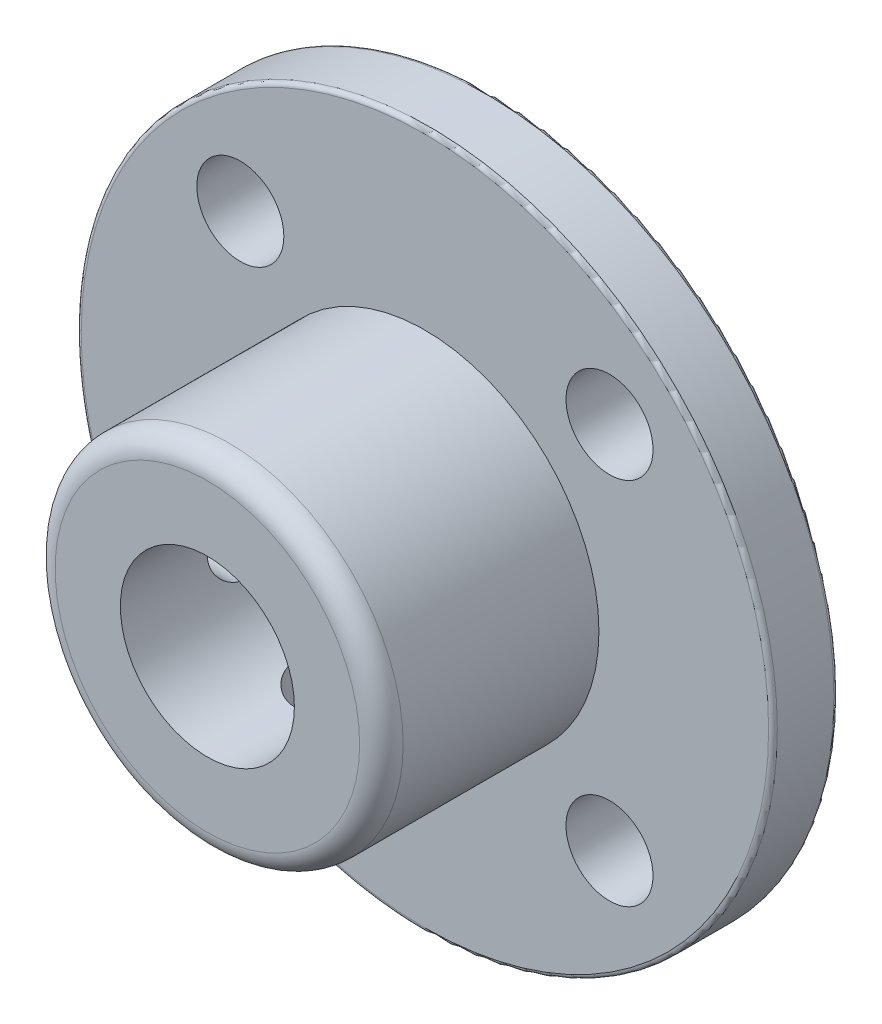
ISO-10303-21;
HEADER;
FILE_DESCRIPTION(('STEP AP214'),'2;1');
FILE_NAME('part.step','',(''),(''),'','','');
FILE_SCHEMA(('AUTOMOTIVE_DESIGN { 1 0 10303 214 1 1 1 1 }'));
ENDSEC;
DATA;
#1=APPLICATION_CONTEXT('core data for automotive mechanical design processes');
#2=APPLICATION_PROTOCOL_DEFINITION('international standard','automotive_design',2000,#1);
#3=PRODUCT_CONTEXT('',#1,'mechanical');
#4=PRODUCT('Part','Part','',(#3));
#5=PRODUCT_RELATED_PRODUCT_CATEGORY('part','',(#4));
#6=PRODUCT_DEFINITION_FORMATION('','',#4);
#7=PRODUCT_DEFINITION_CONTEXT('part definition',#1,'design');
#8=PRODUCT_DEFINITION('design','',#6,#7);
#9=PRODUCT_DEFINITION_SHAPE('','',#8);
#10=(LENGTH_UNIT() NAMED_UNIT(*) SI_UNIT(.MILLI.,.METRE.));
#11=(NAMED_UNIT(*) PLANE_ANGLE_UNIT() SI_UNIT($,.RADIAN.));
#12=(NAMED_UNIT(*) SI_UNIT($,.STERADIAN.) SOLID_ANGLE_UNIT());
#13=UNCERTAINTY_MEASURE_WITH_UNIT(LENGTH_MEASURE(1.E-05),#10,'distance_accuracy_value','');
#14=(GEOMETRIC_REPRESENTATION_CONTEXT(3) GLOBAL_UNCERTAINTY_ASSIGNED_CONTEXT((#13)) GLOBAL_UNIT_ASSIGNED_CONTEXT((#10,
#11,#12)) REPRESENTATION_CONTEXT('',''));
#15=CARTESIAN_POINT('',(0.,0.,0.));
#16=DIRECTION('',(0.,0.,1.));
#17=DIRECTION('',(1.,0.,0.));
#18=AXIS2_PLACEMENT_3D('',#15,#16,#17);
#19=CARTESIAN_POINT('',(0.,0.,3.));
#20=DIRECTION('',(0.,0.,-1.));
#21=DIRECTION('',(-1.,0.,0.));
#22=AXIS2_PLACEMENT_3D('',#19,#20,#21);
#23=CYLINDRICAL_SURFACE('',#22,16.);
#24=CARTESIAN_POINT('',(0.,0.,0.2));
#25=DIRECTION('',(0.,0.,1.));
#26=DIRECTION('',(1.,0.,0.));
#27=AXIS2_PLACEMENT_3D('',#24,#25,#26);
#28=CIRCLE('',#27,16.);
#29=CARTESIAN_POINT('',(16.,0.,0.2));
#30=VERTEX_POINT('',#29);
#31=EDGE_CURVE('E47',#30,#30,#28,.T.);
#32=ORIENTED_EDGE('',*,*,#31,.T.);
#33=EDGE_LOOP('',(#32));
#34=FACE_BOUND('',#33,.T.);
#35=CARTESIAN_POINT('',(0.,0.,2.8));
#36=DIRECTION('',(0.,0.,1.));
#37=DIRECTION('',(1.,0.,0.));
#38=AXIS2_PLACEMENT_3D('',#35,#36,#37);
#39=CIRCLE('',#38,16.);
#40=CARTESIAN_POINT('',(16.,0.,2.8));
#41=VERTEX_POINT('',#40);
#42=EDGE_CURVE('E51',#41,#41,#39,.F.);
#43=ORIENTED_EDGE('',*,*,#42,.T.);
#44=EDGE_LOOP('',(#43));
#45=FACE_BOUND('',#44,.T.);
#46=ADVANCED_FACE('F36',(#34,#45),#23,.T.);
#47=CARTESIAN_POINT('',(0.,0.,3.));
#48=DIRECTION('',(0.,0.,1.));
#49=DIRECTION('',(1.,0.,0.));
#50=AXIS2_PLACEMENT_3D('',#47,#48,#49);
#51=PLANE('',#50);
#52=CARTESIAN_POINT('',(0.,0.,3.));
#53=DIRECTION('',(0.,0.,1.));
#54=DIRECTION('',(1.,0.,0.));
#55=AXIS2_PLACEMENT_3D('',#52,#53,#54);
#56=CIRCLE('',#55,15.8);
#57=CARTESIAN_POINT('',(15.8,0.,3.));
#58=VERTEX_POINT('',#57);
#59=EDGE_CURVE('E10',#58,#58,#56,.T.);
#60=ORIENTED_EDGE('',*,*,#59,.T.);
#61=EDGE_LOOP('',(#60));
#62=FACE_BOUND('',#61,.T.);
#63=CARTESIAN_POINT('',(-8.48528137423857,-8.48528137423857,3.));
#64=DIRECTION('',(0.,0.,1.));
#65=DIRECTION('',(1.,0.,0.));
#66=AXIS2_PLACEMENT_3D('',#63,#64,#65);
#67=CIRCLE('',#66,2.);
#68=CARTESIAN_POINT('',(-6.48528137423857,-8.48528137423857,3.));
#69=VERTEX_POINT('',#68);
#70=EDGE_CURVE('E275',#69,#69,#67,.T.);
#71=ORIENTED_EDGE('',*,*,#70,.F.);
#72=EDGE_LOOP('',(#71));
#73=FACE_BOUND('',#72,.T.);
#74=CARTESIAN_POINT('',(8.48528137423857,-8.48528137423857,3.));
#75=DIRECTION('',(0.,0.,1.));
#76=DIRECTION('',(1.,0.,0.));
#77=AXIS2_PLACEMENT_3D('',#74,#75,#76);
#78=CIRCLE('',#77,2.);
#79=CARTESIAN_POINT('',(10.4852813742386,-8.48528137423857,3.));
#80=VERTEX_POINT('',#79);
#81=EDGE_CURVE('E281',#80,#80,#78,.T.);
#82=ORIENTED_EDGE('',*,*,#81,.F.);
#83=EDGE_LOOP('',(#82));
#84=FACE_BOUND('',#83,.T.);
#85=CARTESIAN_POINT('',(8.48528137423857,8.48528137423857,3.));
#86=DIRECTION('',(0.,0.,1.));
#87=DIRECTION('',(1.,0.,0.));
#88=AXIS2_PLACEMENT_3D('',#85,#86,#87);
#89=CIRCLE('',#88,2.);
#90=CARTESIAN_POINT('',(10.4852813742386,8.48528137423857,3.));
#91=VERTEX_POINT('',#90);
#92=EDGE_CURVE('E248',#91,#91,#89,.T.);
#93=ORIENTED_EDGE('',*,*,#92,.F.);
#94=EDGE_LOOP('',(#93));
#95=FACE_BOUND('',#94,.T.);
#96=CARTESIAN_POINT('',(-8.48528137423857,8.48528137423857,3.));
#97=DIRECTION('',(0.,0.,1.));
#98=DIRECTION('',(1.,0.,0.));
#99=AXIS2_PLACEMENT_3D('',#96,#97,#98);
#100=CIRCLE('',#99,2.);
#101=CARTESIAN_POINT('',(-6.48528137423857,8.48528137423857,3.));
#102=VERTEX_POINT('',#101);
#103=EDGE_CURVE('E241',#102,#102,#100,.T.);
#104=ORIENTED_EDGE('',*,*,#103,.F.);
#105=EDGE_LOOP('',(#104));
#106=FACE_BOUND('',#105,.T.);
#107=CARTESIAN_POINT('',(0.,0.,3.));
#108=DIRECTION('',(0.,0.,1.));
#109=DIRECTION('',(1.,0.,0.));
#110=AXIS2_PLACEMENT_3D('',#107,#108,#109);
#111=CIRCLE('',#110,8.);
#112=CARTESIAN_POINT('',(8.,0.,3.));
#113=VERTEX_POINT('',#112);
#114=EDGE_CURVE('E254',#113,#113,#111,.T.);
#115=ORIENTED_EDGE('',*,*,#114,.F.);
#116=EDGE_LOOP('',(#115));
#117=FACE_BOUND('',#116,.T.);
#118=ADVANCED_FACE('F104',(#62,#73,#84,#95,#106,#117),#51,.T.);
#119=CARTESIAN_POINT('',(0.,0.,0.));
#120=DIRECTION('',(0.,0.,1.));
#121=DIRECTION('',(1.,0.,0.));
#122=AXIS2_PLACEMENT_3D('',#119,#120,#121);
#123=PLANE('',#122);
#124=CARTESIAN_POINT('',(0.,0.,0.));
#125=DIRECTION('',(0.,0.,1.));
#126=DIRECTION('',(1.,0.,0.));
#127=AXIS2_PLACEMENT_3D('',#124,#125,#126);
#128=CIRCLE('',#127,15.8);
#129=CARTESIAN_POINT('',(15.8,0.,0.));
#130=VERTEX_POINT('',#129);
#131=EDGE_CURVE('E43',#130,#130,#128,.F.);
#132=ORIENTED_EDGE('',*,*,#131,.T.);
#133=EDGE_LOOP('',(#132));
#134=FACE_BOUND('',#133,.T.);
#135=CARTESIAN_POINT('',(-8.48528137423857,-8.48528137423857,0.));
#136=DIRECTION('',(0.,0.,1.));
#137=DIRECTION('',(1.,0.,0.));
#138=AXIS2_PLACEMENT_3D('',#135,#136,#137);
#139=CIRCLE('',#138,2.);
#140=CARTESIAN_POINT('',(-6.48528137423857,-8.48528137423857,0.));
#141=VERTEX_POINT('',#140);
#142=EDGE_CURVE('E278',#141,#141,#139,.T.);
#143=ORIENTED_EDGE('',*,*,#142,.T.);
#144=EDGE_LOOP('',(#143));
#145=FACE_BOUND('',#144,.T.);
#146=CARTESIAN_POINT('',(8.48528137423857,-8.48528137423857,0.));
#147=DIRECTION('',(0.,0.,1.));
#148=DIRECTION('',(1.,0.,0.));
#149=AXIS2_PLACEMENT_3D('',#146,#147,#148);
#150=CIRCLE('',#149,2.);
#151=CARTESIAN_POINT('',(10.4852813742386,-8.48528137423857,0.));
#152=VERTEX_POINT('',#151);
#153=EDGE_CURVE('E284',#152,#152,#150,.T.);
#154=ORIENTED_EDGE('',*,*,#153,.T.);
#155=EDGE_LOOP('',(#154));
#156=FACE_BOUND('',#155,.T.);
#157=CARTESIAN_POINT('',(8.48528137423857,8.48528137423857,0.));
#158=DIRECTION('',(0.,0.,1.));
#159=DIRECTION('',(1.,0.,0.));
#160=AXIS2_PLACEMENT_3D('',#157,#158,#159);
#161=CIRCLE('',#160,2.);
#162=CARTESIAN_POINT('',(10.4852813742386,8.48528137423857,0.));
#163=VERTEX_POINT('',#162);
#164=EDGE_CURVE('E243',#163,#163,#161,.T.);
#165=ORIENTED_EDGE('',*,*,#164,.T.);
#166=EDGE_LOOP('',(#165));
#167=FACE_BOUND('',#166,.T.);
#168=CARTESIAN_POINT('',(-8.48528137423857,8.48528137423857,0.));
#169=DIRECTION('',(0.,0.,1.));
#170=DIRECTION('',(1.,0.,0.));
#171=AXIS2_PLACEMENT_3D('',#168,#169,#170);
#172=CIRCLE('',#171,2.);
#173=CARTESIAN_POINT('',(-6.48528137423857,8.48528137423857,0.));
#174=VERTEX_POINT('',#173);
#175=EDGE_CURVE('E238',#174,#174,#172,.T.);
#176=ORIENTED_EDGE('',*,*,#175,.T.);
#177=EDGE_LOOP('',(#176));
#178=FACE_BOUND('',#177,.T.);
#179=CARTESIAN_POINT('',(0.,0.,0.));
#180=DIRECTION('',(0.,0.,1.));
#181=DIRECTION('',(1.,0.,0.));
#182=AXIS2_PLACEMENT_3D('',#179,#180,#181);
#183=CIRCLE('',#182,4.);
#184=CARTESIAN_POINT('',(4.,0.,0.));
#185=VERTEX_POINT('',#184);
#186=EDGE_CURVE('E251',#185,#185,#183,.T.);
#187=ORIENTED_EDGE('',*,*,#186,.T.);
#188=EDGE_LOOP('',(#187));
#189=FACE_BOUND('',#188,.T.);
#190=ADVANCED_FACE('F102',(#134,#145,#156,#167,#178,#189),#123,.F.);
#191=CARTESIAN_POINT('',(0.,0.,13.));
#192=DIRECTION('',(0.,0.,-1.));
#193=DIRECTION('',(-1.,0.,0.));
#194=AXIS2_PLACEMENT_3D('',#191,#192,#193);
#195=CYLINDRICAL_SURFACE('',#194,8.);
#196=CARTESIAN_POINT('',(0.,-8.,9.));
#197=CARTESIAN_POINT('',(0.0834717464654709,-7.99999848833852,8.99999681041172));
#198=CARTESIAN_POINT('',(0.166984992730099,-7.99868009921714,8.99300892338062));
#199=CARTESIAN_POINT('',(0.331658129841797,-7.9935478589052,8.96526000488165));
#200=CARTESIAN_POINT('',(0.412815974152225,-7.98973190166897,8.94448734936027));
#201=CARTESIAN_POINT('',(0.570372961851801,-7.98003138765458,8.88982729874066));
#202=CARTESIAN_POINT('',(0.646776330685344,-7.97414869946483,8.85595174754746));
#203=CARTESIAN_POINT('',(0.792807973094007,-7.96095710599783,8.77608112307718));
#204=CARTESIAN_POINT('',(0.862436794477323,-7.9536483161829,8.73008703085518));
#205=CARTESIAN_POINT('',(0.993783715930502,-7.93831336430504,8.62670023199632));
#206=CARTESIAN_POINT('',(1.05540895503183,-7.93028034856351,8.56919055532986));
#207=CARTESIAN_POINT('',(1.16819606135369,-7.9144531845865,8.44465669091244));
#208=CARTESIAN_POINT('',(1.21935717689241,-7.90665905354527,8.37763182023071));
#209=CARTESIAN_POINT('',(1.31014998665793,-7.89212551245005,8.23531391163603));
#210=CARTESIAN_POINT('',(1.34968721969605,-7.88539493886182,8.15995962968276));
#211=CARTESIAN_POINT('',(1.41550524332283,-7.87384713211987,8.00353108482321));
#212=CARTESIAN_POINT('',(1.44178717713098,-7.86902973396962,7.92245731588878));
#213=CARTESIAN_POINT('',(1.480050535035,-7.8619226957455,7.75788476908559));
#214=CARTESIAN_POINT('',(1.49219390192039,-7.85960445366405,7.67442490279654));
#215=CARTESIAN_POINT('',(1.50233808095346,-7.85767197152761,7.50662261519175));
#216=CARTESIAN_POINT('',(1.50034016135374,-7.8580574889876,7.4222802736977));
#217=CARTESIAN_POINT('',(1.48238979602362,-7.86146292701753,7.25628047473395));
#218=CARTESIAN_POINT('',(1.46662149996045,-7.86444808147334,7.17460228569985));
#219=CARTESIAN_POINT('',(1.42186799396207,-7.87266183284666,7.01507158021739));
#220=CARTESIAN_POINT('',(1.39288222239499,-7.87789052509516,6.9372192264907));
#221=CARTESIAN_POINT('',(1.322336471793,-7.89003855292588,6.78701132099974));
#222=CARTESIAN_POINT('',(1.28070213532456,-7.89696783823366,6.71469152941919));
#223=CARTESIAN_POINT('',(1.18609368930416,-7.91172971602918,6.57799527145977));
#224=CARTESIAN_POINT('',(1.13311842889266,-7.91956240015522,6.5136196122852));
#225=CARTESIAN_POINT('',(1.01633905685298,-7.93540001272164,6.39357504432754));
#226=CARTESIAN_POINT('',(0.952377436860683,-7.9434057102403,6.33805934754826));
#227=CARTESIAN_POINT('',(0.815968037098827,-7.95857386108318,6.23852275932459));
#228=CARTESIAN_POINT('',(0.74352017225577,-7.96573630595245,6.19450198312958));
#229=CARTESIAN_POINT('',(0.592034988874669,-7.97842539677509,6.11918224612998));
#230=CARTESIAN_POINT('',(0.512989564446494,-7.98394999136289,6.0878992208821));
#231=CARTESIAN_POINT('',(0.350639115398697,-7.99272505402719,6.03909790690784));
#232=CARTESIAN_POINT('',(0.267334544277787,-7.99597576367994,6.02157815595464));
#233=CARTESIAN_POINT('',(0.100148652903386,-7.99980360641981,6.00101396898173));
#234=CARTESIAN_POINT('',(0.0162940126341359,-8.00041950912279,5.99775960847027));
#235=CARTESIAN_POINT('',(-0.150761248092183,-7.99901543598228,6.00525547954765));
#236=CARTESIAN_POINT('',(-0.233961900480385,-7.99699558964431,6.01600502306526));
#237=CARTESIAN_POINT('',(-0.396681573218217,-7.99057111500406,6.05102903518337));
#238=CARTESIAN_POINT('',(-0.476224261046063,-7.98618522374031,6.07519728253781));
#239=CARTESIAN_POINT('',(-0.630128631824633,-7.97551842212498,6.13625770677879));
#240=CARTESIAN_POINT('',(-0.704489962595103,-7.96923738311334,6.17315074756578));
#241=CARTESIAN_POINT('',(-0.846816671513214,-7.95538030357666,6.25907812815951));
#242=CARTESIAN_POINT('',(-0.914703277015121,-7.94779086174563,6.30824073853684));
#243=CARTESIAN_POINT('',(-1.04133832326455,-7.93219343489712,6.41713813736236));
#244=CARTESIAN_POINT('',(-1.10008590976087,-7.92418541084687,6.47687391300133));
#245=CARTESIAN_POINT('',(-1.20757295872048,-7.9085247569745,6.60617231891143));
#246=CARTESIAN_POINT('',(-1.25616916218577,-7.90087825860257,6.67585490812539));
#247=CARTESIAN_POINT('',(-1.34096675057787,-7.88692985578532,6.82251762452375));
#248=CARTESIAN_POINT('',(-1.37716859613924,-7.8806279013735,6.89949748037047));
#249=CARTESIAN_POINT('',(-1.43594673512823,-7.87013024209574,7.05820586724254));
#250=CARTESIAN_POINT('',(-1.45858868794786,-7.86592440436878,7.13990937955933));
#251=CARTESIAN_POINT('',(-1.48980679326235,-7.86007203802415,7.3060472225214));
#252=CARTESIAN_POINT('',(-1.49838453270708,-7.8584252206579,7.3904812439704));
#253=CARTESIAN_POINT('',(-1.50117762148355,-7.85789199803857,7.55824833144151));
#254=CARTESIAN_POINT('',(-1.49561895003499,-7.85896215974293,7.64157758095699));
#255=CARTESIAN_POINT('',(-1.47079175378803,-7.86364600659998,7.80609142204529));
#256=CARTESIAN_POINT('',(-1.45152331089332,-7.86725967655747,7.88727602642744));
#257=CARTESIAN_POINT('',(-1.39991887583263,-7.8766050802318,8.04507448479548));
#258=CARTESIAN_POINT('',(-1.36760735397252,-7.88233284594965,8.12169659134577));
#259=CARTESIAN_POINT('',(-1.29085868912204,-7.8952638755184,8.26846825424084));
#260=CARTESIAN_POINT('',(-1.24642068948186,-7.90246724360119,8.33861735284478));
#261=CARTESIAN_POINT('',(-1.14589487339535,-7.91767266107745,8.4715836800423));
#262=CARTESIAN_POINT('',(-1.08964259864303,-7.92568505353043,8.5342754125671));
#263=CARTESIAN_POINT('',(-0.96742792674229,-7.94152833918735,8.64940516246452));
#264=CARTESIAN_POINT('',(-0.901463301891615,-7.94935919027328,8.70184082098014));
#265=CARTESIAN_POINT('',(-0.760984945071872,-7.96403975968049,8.79541095262706));
#266=CARTESIAN_POINT('',(-0.686399590640516,-7.97088000990561,8.83643942849064));
#267=CARTESIAN_POINT('',(-0.531290113653833,-7.98271619380687,8.90531763660514));
#268=CARTESIAN_POINT('',(-0.450771651705247,-7.98771385879037,8.93317974704691));
#269=CARTESIAN_POINT('',(-0.308347202825153,-7.99428290707632,8.96927731441867));
#270=CARTESIAN_POINT('',(-0.24727381025187,-7.99641470878206,8.9807786303128));
#271=CARTESIAN_POINT('',(-0.124141247115158,-7.9992737995401,8.99614106211645));
#272=CARTESIAN_POINT('',(-0.0620821016527095,-8.00000112429805,9.00000237225591));
#273=CARTESIAN_POINT('',(0.,-8.,9.));
#274=B_SPLINE_CURVE_WITH_KNOTS('',3,(#196,#197,#198,#199,#200,#201,#202,#203,#204,#205,#206,
#207,#208,#209,#210,#211,#212,#213,#214,#215,#216,#217,#218,#219,#220,#221,#222,#223,#224,#225,
#226,#227,#228,#229,#230,#231,#232,#233,#234,#235,#236,#237,#238,#239,#240,#241,#242,#243,#244,
#245,#246,#247,#248,#249,#250,#251,#252,#253,#254,#255,#256,#257,#258,#259,#260,#261,#262,#263,
#264,#265,#266,#267,#268,#269,#270,#271,#272,#273),.UNSPECIFIED.,.T.,.F.,(4,2,2,2,2,2,2,2,2,2,2,
2,2,2,2,2,2,2,2,2,2,2,2,2,2,2,2,2,2,2,2,2,2,2,2,2,2,2,4),(0.,0.250188200964924,
0.500587642535452,0.750761271230907,1.00091465336891,1.2537511801363,1.50660586283617,
1.76146190504357,2.01629596311948,2.26818151445336,2.52004447587256,2.76859000612765,
3.01714609846786,3.2671926262953,3.51726454049859,3.77127768464077,4.02529337544948,
4.27962588321699,4.53393136673745,4.78448174076097,5.03501980464583,5.28360233907828,
5.53220175338032,5.78351778017708,6.03485728413098,6.28953436987299,6.54420198954945,
6.79762627818559,7.05102196946513,7.30039252231748,7.54976158541506,7.79866496207692,
8.04758592655423,8.3002336996638,8.55293951262255,8.80792048916315,9.06266126931173,
9.24874344524409,9.43482089039541),.UNSPECIFIED.);
#275=CARTESIAN_POINT('',(0.,-8.,9.));
#276=VERTEX_POINT('',#275);
#277=EDGE_CURVE('E65',#276,#276,#274,.T.);
#278=ORIENTED_EDGE('',*,*,#277,.T.);
#279=EDGE_LOOP('',(#278));
#280=FACE_BOUND('',#279,.T.);
#281=CARTESIAN_POINT('',(-8.,0.,9.));
#282=CARTESIAN_POINT('',(-7.99999848833852,-0.0834717464654709,8.99999681041172));
#283=CARTESIAN_POINT('',(-7.99868009921714,-0.166984992730099,8.99300892338062));
#284=CARTESIAN_POINT('',(-7.9935478589052,-0.331658129841798,8.96526000488165));
#285=CARTESIAN_POINT('',(-7.98973190166897,-0.412815974152226,8.94448734936027));
#286=CARTESIAN_POINT('',(-7.98003138765458,-0.570372961851802,8.88982729874066));
#287=CARTESIAN_POINT('',(-7.97414869946483,-0.646776330685345,8.85595174754746));
#288=CARTESIAN_POINT('',(-7.96095710599783,-0.792807973094008,8.77608112307718));
#289=CARTESIAN_POINT('',(-7.9536483161829,-0.862436794477324,8.73008703085518));
#290=CARTESIAN_POINT('',(-7.93831336430504,-0.993783715930504,8.62670023199632));
#291=CARTESIAN_POINT('',(-7.93028034856351,-1.05540895503183,8.56919055532986));
#292=CARTESIAN_POINT('',(-7.9144531845865,-1.16819606135369,8.44465669091244));
#293=CARTESIAN_POINT('',(-7.90665905354527,-1.21935717689242,8.37763182023071));
#294=CARTESIAN_POINT('',(-7.89212551245005,-1.31014998665793,8.23531391163603));
#295=CARTESIAN_POINT('',(-7.88539493886182,-1.34968721969606,8.15995962968276));
#296=CARTESIAN_POINT('',(-7.87384713211987,-1.41550524332283,8.00353108482321));
#297=CARTESIAN_POINT('',(-7.86902973396962,-1.44178717713098,7.92245731588878));
#298=CARTESIAN_POINT('',(-7.8619226957455,-1.480050535035,7.75788476908559));
#299=CARTESIAN_POINT('',(-7.85960445366405,-1.49219390192039,7.67442490279653));
#300=CARTESIAN_POINT('',(-7.85767197152761,-1.50233808095347,7.50662261519175));
#301=CARTESIAN_POINT('',(-7.8580574889876,-1.50034016135374,7.4222802736977));
#302=CARTESIAN_POINT('',(-7.86146292701753,-1.48238979602363,7.25628047473395));
#303=CARTESIAN_POINT('',(-7.86444808147334,-1.46662149996045,7.17460228569985));
#304=CARTESIAN_POINT('',(-7.87266183284666,-1.42186799396207,7.01507158021739));
#305=CARTESIAN_POINT('',(-7.87789052509516,-1.392882222395,6.9372192264907));
#306=CARTESIAN_POINT('',(-7.89003855292588,-1.322336471793,6.78701132099974));
#307=CARTESIAN_POINT('',(-7.89696783823366,-1.28070213532456,6.71469152941919));
#308=CARTESIAN_POINT('',(-7.91172971602918,-1.18609368930416,6.57799527145977));
#309=CARTESIAN_POINT('',(-7.91956240015522,-1.13311842889266,6.5136196122852));
#310=CARTESIAN_POINT('',(-7.93540001272164,-1.01633905685298,6.39357504432754));
#311=CARTESIAN_POINT('',(-7.94340571024031,-0.952377436860685,6.33805934754826));
#312=CARTESIAN_POINT('',(-7.95857386108318,-0.815968037098829,6.23852275932459));
#313=CARTESIAN_POINT('',(-7.96573630595245,-0.743520172255772,6.19450198312958));
#314=CARTESIAN_POINT('',(-7.97842539677509,-0.592034988874671,6.11918224612998));
#315=CARTESIAN_POINT('',(-7.98394999136289,-0.512989564446497,6.0878992208821));
#316=CARTESIAN_POINT('',(-7.99272505402719,-0.350639115398699,6.03909790690784));
#317=CARTESIAN_POINT('',(-7.99597576367994,-0.26733454427779,6.02157815595464));
#318=CARTESIAN_POINT('',(-7.99980360641981,-0.100148652903388,6.00101396898173));
#319=CARTESIAN_POINT('',(-8.00041950912279,-0.0162940126341377,5.99775960847027));
#320=CARTESIAN_POINT('',(-7.99901543598228,0.150761248092182,6.00525547954765));
#321=CARTESIAN_POINT('',(-7.99699558964431,0.233961900480383,6.01600502306526));
#322=CARTESIAN_POINT('',(-7.99057111500406,0.396681573218215,6.05102903518337));
#323=CARTESIAN_POINT('',(-7.98618522374031,0.476224261046061,6.07519728253781));
#324=CARTESIAN_POINT('',(-7.97551842212498,0.630128631824631,6.13625770677878));
#325=CARTESIAN_POINT('',(-7.96923738311334,0.704489962595101,6.17315074756578));
#326=CARTESIAN_POINT('',(-7.95538030357666,0.846816671513212,6.25907812815951));
#327=CARTESIAN_POINT('',(-7.94779086174563,0.914703277015119,6.30824073853684));
#328=CARTESIAN_POINT('',(-7.93219343489712,1.04133832326454,6.41713813736236));
#329=CARTESIAN_POINT('',(-7.92418541084687,1.10008590976086,6.47687391300133));
#330=CARTESIAN_POINT('',(-7.9085247569745,1.20757295872048,6.60617231891142));
#331=CARTESIAN_POINT('',(-7.90087825860257,1.25616916218576,6.67585490812538));
#332=CARTESIAN_POINT('',(-7.88692985578532,1.34096675057787,6.82251762452375));
#333=CARTESIAN_POINT('',(-7.8806279013735,1.37716859613924,6.89949748037047));
#334=CARTESIAN_POINT('',(-7.87013024209574,1.43594673512823,7.05820586724254));
#335=CARTESIAN_POINT('',(-7.86592440436878,1.45858868794786,7.13990937955933));
#336=CARTESIAN_POINT('',(-7.86007203802415,1.48980679326235,7.3060472225214));
#337=CARTESIAN_POINT('',(-7.8584252206579,1.49838453270708,7.3904812439704));
#338=CARTESIAN_POINT('',(-7.85789199803857,1.50117762148355,7.55824833144151));
#339=CARTESIAN_POINT('',(-7.85896215974293,1.49561895003499,7.64157758095699));
#340=CARTESIAN_POINT('',(-7.86364600659998,1.47079175378803,7.80609142204529));
#341=CARTESIAN_POINT('',(-7.86725967655747,1.45152331089332,7.88727602642744));
#342=CARTESIAN_POINT('',(-7.8766050802318,1.39991887583263,8.04507448479548));
#343=CARTESIAN_POINT('',(-7.88233284594965,1.36760735397252,8.12169659134577));
#344=CARTESIAN_POINT('',(-7.8952638755184,1.29085868912204,8.26846825424084));
#345=CARTESIAN_POINT('',(-7.90246724360119,1.24642068948186,8.33861735284478));
#346=CARTESIAN_POINT('',(-7.91767266107745,1.14589487339535,8.47158368004229));
#347=CARTESIAN_POINT('',(-7.92568505353043,1.08964259864303,8.5342754125671));
#348=CARTESIAN_POINT('',(-7.94152833918735,0.967427926742289,8.64940516246452));
#349=CARTESIAN_POINT('',(-7.94935919027328,0.901463301891614,8.70184082098013));
#350=CARTESIAN_POINT('',(-7.96403975968049,0.760984945071871,8.79541095262706));
#351=CARTESIAN_POINT('',(-7.97088000990561,0.686399590640515,8.83643942849064));
#352=CARTESIAN_POINT('',(-7.98271619380687,0.531290113653832,8.90531763660513));
#353=CARTESIAN_POINT('',(-7.98771385879037,0.450771651705246,8.93317974704691));
#354=CARTESIAN_POINT('',(-7.99428290707632,0.308347202825153,8.96927731441867));
#355=CARTESIAN_POINT('',(-7.99641470878206,0.24727381025187,8.9807786303128));
#356=CARTESIAN_POINT('',(-7.9992737995401,0.124141247115158,8.99614106211645));
#357=CARTESIAN_POINT('',(-8.00000112429805,0.0620821016527094,9.00000237225591));
#358=CARTESIAN_POINT('',(-8.,0.,9.));
#359=B_SPLINE_CURVE_WITH_KNOTS('',3,(#281,#282,#283,#284,#285,#286,#287,#288,#289,#290,#291,
#292,#293,#294,#295,#296,#297,#298,#299,#300,#301,#302,#303,#304,#305,#306,#307,#308,#309,#310,
#311,#312,#313,#314,#315,#316,#317,#318,#319,#320,#321,#322,#323,#324,#325,#326,#327,#328,#329,
#330,#331,#332,#333,#334,#335,#336,#337,#338,#339,#340,#341,#342,#343,#344,#345,#346,#347,#348,
#349,#350,#351,#352,#353,#354,#355,#356,#357,#358),.UNSPECIFIED.,.T.,.F.,(4,2,2,2,2,2,2,2,2,2,2,
2,2,2,2,2,2,2,2,2,2,2,2,2,2,2,2,2,2,2,2,2,2,2,2,2,2,2,4),(0.,0.250188200964924,
0.500587642535452,0.750761271230908,1.00091465336891,1.25375118013631,1.50660586283617,
1.76146190504358,2.01629596311949,2.26818151445336,2.52004447587256,2.76859000612766,
3.01714609846787,3.26719262629531,3.5172645404986,3.77127768464077,4.02529337544948,
4.27962588321699,4.53393136673746,4.78448174076097,5.03501980464584,5.28360233907829,
5.53220175338032,5.78351778017709,6.03485728413099,6.28953436987299,6.54420198954945,
6.79762627818559,7.05102196946513,7.30039252231748,7.54976158541507,7.79866496207693,
8.04758592655423,8.30023369966381,8.55293951262256,8.80792048916315,9.06266126931174,
9.2487434452441,9.43482089039541),.UNSPECIFIED.);
#360=CARTESIAN_POINT('',(-8.,0.,9.));
#361=VERTEX_POINT('',#360);
#362=EDGE_CURVE('E92',#361,#361,#359,.T.);
#363=ORIENTED_EDGE('',*,*,#362,.T.);
#364=EDGE_LOOP('',(#363));
#365=FACE_BOUND('',#364,.T.);
#366=CARTESIAN_POINT('',(0.,0.,12.));
#367=DIRECTION('',(0.,0.,1.));
#368=DIRECTION('',(1.,0.,0.));
#369=AXIS2_PLACEMENT_3D('',#366,#367,#368);
#370=CIRCLE('',#369,8.);
#371=CARTESIAN_POINT('',(8.,0.,12.));
#372=VERTEX_POINT('',#371);
#373=EDGE_CURVE('E56',#372,#372,#370,.F.);
#374=ORIENTED_EDGE('',*,*,#373,.T.);
#375=EDGE_LOOP('',(#374));
#376=FACE_BOUND('',#375,.T.);
#377=ORIENTED_EDGE('',*,*,#114,.T.);
#378=EDGE_LOOP('',(#377));
#379=FACE_BOUND('',#378,.T.);
#380=ADVANCED_FACE('F97',(#280,#365,#376,#379),#195,.T.);
#381=CARTESIAN_POINT('',(0.,0.,13.));
#382=DIRECTION('',(0.,0.,1.));
#383=DIRECTION('',(1.,0.,0.));
#384=AXIS2_PLACEMENT_3D('',#381,#382,#383);
#385=PLANE('',#384);
#386=CARTESIAN_POINT('',(0.,0.,13.));
#387=DIRECTION('',(0.,0.,1.));
#388=DIRECTION('',(1.,0.,0.));
#389=AXIS2_PLACEMENT_3D('',#386,#387,#388);
#390=CIRCLE('',#389,7.);
#391=CARTESIAN_POINT('',(7.,0.,13.));
#392=VERTEX_POINT('',#391);
#393=EDGE_CURVE('E259',#392,#392,#390,.T.);
#394=ORIENTED_EDGE('',*,*,#393,.T.);
#395=EDGE_LOOP('',(#394));
#396=FACE_BOUND('',#395,.T.);
#397=CARTESIAN_POINT('',(0.,0.,13.));
#398=DIRECTION('',(0.,0.,1.));
#399=DIRECTION('',(1.,0.,0.));
#400=AXIS2_PLACEMENT_3D('',#397,#398,#399);
#401=CIRCLE('',#400,4.);
#402=CARTESIAN_POINT('',(4.,0.,13.));
#403=VERTEX_POINT('',#402);
#404=EDGE_CURVE('E245',#403,#403,#401,.T.);
#405=ORIENTED_EDGE('',*,*,#404,.F.);
#406=EDGE_LOOP('',(#405));
#407=FACE_BOUND('',#406,.T.);
#408=ADVANCED_FACE('F101',(#396,#407),#385,.T.);
#409=CARTESIAN_POINT('',(0.,0.,0.));
#410=DIRECTION('',(0.,0.,1.));
#411=DIRECTION('',(1.,0.,0.));
#412=AXIS2_PLACEMENT_3D('',#409,#410,#411);
#413=CYLINDRICAL_SURFACE('',#412,4.);
#414=CARTESIAN_POINT('',(0.,-4.,9.));
#415=CARTESIAN_POINT('',(-0.0812350589378528,-4.00000217456151,9.00000290230311));
#416=CARTESIAN_POINT('',(-0.162450241781792,-3.99750379283184,8.99338023975162));
#417=CARTESIAN_POINT('',(-0.322453452352361,-3.98778696006928,8.96717180473007));
#418=CARTESIAN_POINT('',(-0.401241827987616,-3.98056918893993,8.94758789952943));
#419=CARTESIAN_POINT('',(-0.554060784990878,-3.96218832391545,8.89624699822824));
#420=CARTESIAN_POINT('',(-0.628100224162277,-3.9510328434944,8.86451348317821));
#421=CARTESIAN_POINT('',(-0.769799310160253,-3.92588767765353,8.78989358698418));
#422=CARTESIAN_POINT('',(-0.837457239177879,-3.91189723227548,8.74700421445585));
#423=CARTESIAN_POINT('',(-0.967346417045825,-3.88186246971217,8.64938746892909));
#424=CARTESIAN_POINT('',(-1.02927073015119,-3.86576002583566,8.5942697377406));
#425=CARTESIAN_POINT('',(-1.14324421474363,-3.83360220871327,8.47458956534116));
#426=CARTESIAN_POINT('',(-1.19529036359203,-3.81754685135033,8.41002424391213));
#427=CARTESIAN_POINT('',(-1.28998202215985,-3.78662470617731,8.27028253247679));
#428=CARTESIAN_POINT('',(-1.3321939319576,-3.77182648820818,8.19479563345418));
#429=CARTESIAN_POINT('',(-1.40318646334084,-3.74599860237433,8.03715164583148));
#430=CARTESIAN_POINT('',(-1.43197244961239,-3.73496742975881,7.9549972368449));
#431=CARTESIAN_POINT('',(-1.47408431017549,-3.71854412824136,7.7898832597418));
#432=CARTESIAN_POINT('',(-1.48799593218558,-3.71293924350838,7.70709496156456));
#433=CARTESIAN_POINT('',(-1.50179556531648,-3.70738061461215,7.54018384200616));
#434=CARTESIAN_POINT('',(-1.50168936802631,-3.70742453659305,7.45606158612553));
#435=CARTESIAN_POINT('',(-1.48790429610018,-3.71297511632055,7.29423047478704));
#436=CARTESIAN_POINT('',(-1.47503808509003,-3.71815468871122,7.21643909395582));
#437=CARTESIAN_POINT('',(-1.4374416786833,-3.73284938059529,7.06421284959468));
#438=CARTESIAN_POINT('',(-1.41270969663258,-3.74236515298863,6.98977849338612));
#439=CARTESIAN_POINT('',(-1.35163748571904,-3.76485702190253,6.84472293227177));
#440=CARTESIAN_POINT('',(-1.31508648737101,-3.77789517988166,6.7742005138787));
#441=CARTESIAN_POINT('',(-1.23156073762698,-3.80594210139319,6.64005426240903));
#442=CARTESIAN_POINT('',(-1.18458238728897,-3.82095154457158,6.5764328224803));
#443=CARTESIAN_POINT('',(-1.07781780766549,-3.85248038859113,6.45339633634912));
#444=CARTESIAN_POINT('',(-1.01738298716956,-3.86903347455671,6.39455135925191));
#445=CARTESIAN_POINT('',(-0.887312590819021,-3.90091728164085,6.2876620337942));
#446=CARTESIAN_POINT('',(-0.817675603497364,-3.91624781465952,6.23961934539433));
#447=CARTESIAN_POINT('',(-0.669723436992419,-3.9442639480908,6.15506960293748));
#448=CARTESIAN_POINT('',(-0.591290713844719,-3.95690498259616,6.11875241877894));
#449=CARTESIAN_POINT('',(-0.428836850524583,-3.97778718326962,6.06001739572996));
#450=CARTESIAN_POINT('',(-0.344818210845767,-3.98603030341493,6.03759338343888));
#451=CARTESIAN_POINT('',(-0.178375243148665,-3.99684443228065,6.00837721245806));
#452=CARTESIAN_POINT('',(-0.0961036195622094,-3.99969369025686,6.00081739361749));
#453=CARTESIAN_POINT('',(0.0685724752550242,-4.00025893700126,5.99930893610008));
#454=CARTESIAN_POINT('',(0.150976912983373,-3.99797606386863,6.00535727968322));
#455=CARTESIAN_POINT('',(0.310262048561859,-3.98871709772643,6.03031004230867));
#456=CARTESIAN_POINT('',(0.387233328007336,-3.98192470962305,6.04871154373708));
#457=CARTESIAN_POINT('',(0.536941754957221,-3.96451477091717,6.09718607254732));
#458=CARTESIAN_POINT('',(0.609678350347534,-3.9538967228203,6.12726061794804));
#459=CARTESIAN_POINT('',(0.751247765110155,-3.92949624407681,6.19918641243948));
#460=CARTESIAN_POINT('',(0.819903083557795,-3.91563000209348,6.24135772922339));
#461=CARTESIAN_POINT('',(0.949392711726625,-3.88626671564664,6.33591810317156));
#462=CARTESIAN_POINT('',(1.01022412027045,-3.87076907009516,6.38831093254515));
#463=CARTESIAN_POINT('',(1.12603079874454,-3.8387332949099,6.50540412212427));
#464=CARTESIAN_POINT('',(1.18046154123569,-3.82218696503729,6.5706421827727));
#465=CARTESIAN_POINT('',(1.27771050031903,-3.79078815746854,6.70965138470766));
#466=CARTESIAN_POINT('',(1.32052767414518,-3.77593583194399,6.7834232913885));
#467=CARTESIAN_POINT('',(1.39337773518998,-3.74966829822463,6.93801598677231));
#468=CARTESIAN_POINT('',(1.42335685446918,-3.73826760328493,7.01886474591044));
#469=CARTESIAN_POINT('',(1.46907883466889,-3.72054032891005,7.18500976368782));
#470=CARTESIAN_POINT('',(1.48483050305535,-3.71421061057491,7.27030323619812));
#471=CARTESIAN_POINT('',(1.50086347097839,-3.70775894792573,7.43701615954112));
#472=CARTESIAN_POINT('',(1.50207331495837,-3.70726444523341,7.51833263171689));
#473=CARTESIAN_POINT('',(1.49136715641593,-3.71158412745292,7.67994531627617));
#474=CARTESIAN_POINT('',(1.47945239850124,-3.71639780898899,7.76024162467158));
#475=CARTESIAN_POINT('',(1.44355815630242,-3.73048141585432,7.91504722671655));
#476=CARTESIAN_POINT('',(1.41995798316524,-3.73961085376663,7.98965834624534));
#477=CARTESIAN_POINT('',(1.3616969677992,-3.76121548297845,8.13390550849442));
#478=CARTESIAN_POINT('',(1.32703332944945,-3.77369151995215,8.20354028807014));
#479=CARTESIAN_POINT('',(1.24552075938154,-3.80139723903965,8.33982678969763));
#480=CARTESIAN_POINT('',(1.1981283280301,-3.81673698440964,8.40613079679991));
#481=CARTESIAN_POINT('',(1.09334485729906,-3.84806246757177,8.5301415609712));
#482=CARTESIAN_POINT('',(1.03595064012808,-3.86404840943145,8.58784557478675));
#483=CARTESIAN_POINT('',(0.909080396784623,-3.89590424609881,8.69620195582184));
#484=CARTESIAN_POINT('',(0.839118644212992,-3.91172104900645,8.74630375343467));
#485=CARTESIAN_POINT('',(0.69121322320082,-3.94054514457031,8.83402265527656));
#486=CARTESIAN_POINT('',(0.613268934090621,-3.95355221851559,8.87163878773637));
#487=CARTESIAN_POINT('',(0.447999082002311,-3.9757429260668,8.93437682904833));
#488=CARTESIAN_POINT('',(0.360413422234207,-3.98473657158356,8.9588870646019));
#489=CARTESIAN_POINT('',(0.181875733606381,-3.99686242179587,8.99169295992068));
#490=CARTESIAN_POINT('',(0.0909254163648584,-3.99999756603967,8.99999675148732));
#491=CARTESIAN_POINT('',(0.,-4.,9.));
#492=B_SPLINE_CURVE_WITH_KNOTS('',3,(#414,#415,#416,#417,#418,#419,#420,#421,#422,#423,#424,
#425,#426,#427,#428,#429,#430,#431,#432,#433,#434,#435,#436,#437,#438,#439,#440,#441,#442,#443,
#444,#445,#446,#447,#448,#449,#450,#451,#452,#453,#454,#455,#456,#457,#458,#459,#460,#461,#462,
#463,#464,#465,#466,#467,#468,#469,#470,#471,#472,#473,#474,#475,#476,#477,#478,#479,#480,#481,
#482,#483,#484,#485,#486,#487,#488,#489,#490,#491),.UNSPECIFIED.,.T.,.F.,(4,2,2,2,2,2,2,2,2,2,2,
2,2,2,2,2,2,2,2,2,2,2,2,2,2,2,2,2,2,2,2,2,2,2,2,2,2,2,4),(0.,0.24336980156056,0.48670454953046,
0.729571369213572,0.972503379609489,1.22473618582715,1.47704604925622,1.73896674501658,
2.00078269352134,2.25185874416901,2.50283106079707,2.73878345119971,2.97477138060589,
3.21522408387018,3.45575990744258,3.71246153335813,3.96920257905066,4.22991375286075,
4.49050899698846,4.73725019635925,4.98393668390521,5.2211443792384,5.45838293254454,
5.702592218596,5.94689180019868,6.20536519455658,6.46386178920141,6.72343066727204,
6.98283874956507,7.22558763480252,7.46831350211259,7.70363142426533,7.93900886656506,
8.18672471884271,8.43451941997062,8.69572329654039,8.95694749805102,9.22948515032042,
9.50188601796127),.UNSPECIFIED.);
#493=CARTESIAN_POINT('',(0.,-4.,9.));
#494=VERTEX_POINT('',#493);
#495=EDGE_CURVE('E57',#494,#494,#492,.T.);
#496=ORIENTED_EDGE('',*,*,#495,.T.);
#497=EDGE_LOOP('',(#496));
#498=FACE_BOUND('',#497,.T.);
#499=CARTESIAN_POINT('',(-4.,0.,6.));
#500=CARTESIAN_POINT('',(-4.00000217456151,-0.0812350589378547,5.99999709769689));
#501=CARTESIAN_POINT('',(-3.99750379283184,-0.162450241781794,6.00661976024838));
#502=CARTESIAN_POINT('',(-3.98778696006928,-0.322453452352363,6.03282819526993));
#503=CARTESIAN_POINT('',(-3.98056918893993,-0.401241827987618,6.05241210047057));
#504=CARTESIAN_POINT('',(-3.96218832391545,-0.55406078499088,6.10375300177176));
#505=CARTESIAN_POINT('',(-3.9510328434944,-0.628100224162279,6.13548651682179));
#506=CARTESIAN_POINT('',(-3.92588767765353,-0.769799310160255,6.21010641301582));
#507=CARTESIAN_POINT('',(-3.91189723227548,-0.837457239177881,6.25299578554415));
#508=CARTESIAN_POINT('',(-3.88186246971217,-0.967346417045828,6.35061253107091));
#509=CARTESIAN_POINT('',(-3.86576002583566,-1.02927073015119,6.4057302622594));
#510=CARTESIAN_POINT('',(-3.83360220871327,-1.14324421474363,6.52541043465884));
#511=CARTESIAN_POINT('',(-3.81754685135033,-1.19529036359203,6.58997575608787));
#512=CARTESIAN_POINT('',(-3.78662470617731,-1.28998202215985,6.72971746752321));
#513=CARTESIAN_POINT('',(-3.77182648820818,-1.3321939319576,6.80520436654582));
#514=CARTESIAN_POINT('',(-3.74599860237433,-1.40318646334085,6.96284835416852));
#515=CARTESIAN_POINT('',(-3.73496742975881,-1.43197244961239,7.0450027631551));
#516=CARTESIAN_POINT('',(-3.71854412824136,-1.47408431017549,7.2101167402582));
#517=CARTESIAN_POINT('',(-3.71293924350838,-1.48799593218558,7.29290503843544));
#518=CARTESIAN_POINT('',(-3.70738061461215,-1.50179556531648,7.45981615799384));
#519=CARTESIAN_POINT('',(-3.70742453659305,-1.50168936802631,7.54393841387447));
#520=CARTESIAN_POINT('',(-3.71297511632054,-1.48790429610018,7.70576952521296));
#521=CARTESIAN_POINT('',(-3.71815468871122,-1.47503808509004,7.78356090604418));
#522=CARTESIAN_POINT('',(-3.73284938059529,-1.4374416786833,7.93578715040532));
#523=CARTESIAN_POINT('',(-3.74236515298863,-1.41270969663259,8.01022150661388));
#524=CARTESIAN_POINT('',(-3.76485702190253,-1.35163748571904,8.15527706772823));
#525=CARTESIAN_POINT('',(-3.77789517988166,-1.31508648737101,8.2257994861213));
#526=CARTESIAN_POINT('',(-3.80594210139319,-1.23156073762698,8.35994573759097));
#527=CARTESIAN_POINT('',(-3.82095154457158,-1.18458238728897,8.4235671775197));
#528=CARTESIAN_POINT('',(-3.85248038859113,-1.07781780766549,8.54660366365088));
#529=CARTESIAN_POINT('',(-3.86903347455671,-1.01738298716956,8.60544864074809));
#530=CARTESIAN_POINT('',(-3.90091728164086,-0.887312590819023,8.7123379662058));
#531=CARTESIAN_POINT('',(-3.91624781465952,-0.817675603497366,8.76038065460567));
#532=CARTESIAN_POINT('',(-3.9442639480908,-0.669723436992422,8.84493039706252));
#533=CARTESIAN_POINT('',(-3.95690498259616,-0.591290713844721,8.88124758122106));
#534=CARTESIAN_POINT('',(-3.97778718326962,-0.428836850524585,8.93998260427004));
#535=CARTESIAN_POINT('',(-3.98603030341493,-0.34481821084577,8.96240661656112));
#536=CARTESIAN_POINT('',(-3.99684443228065,-0.178375243148668,8.99162278754194));
#537=CARTESIAN_POINT('',(-3.99969369025686,-0.0961036195622118,8.99918260638251));
#538=CARTESIAN_POINT('',(-4.00025893700126,0.0685724752550221,9.00069106389992));
#539=CARTESIAN_POINT('',(-3.99797606386863,0.150976912983371,8.99464272031678));
#540=CARTESIAN_POINT('',(-3.98871709772643,0.310262048561858,8.96968995769133));
#541=CARTESIAN_POINT('',(-3.98192470962305,0.387233328007334,8.95128845626292));
#542=CARTESIAN_POINT('',(-3.96451477091717,0.536941754957219,8.90281392745268));
#543=CARTESIAN_POINT('',(-3.9538967228203,0.609678350347533,8.87273938205196));
#544=CARTESIAN_POINT('',(-3.92949624407682,0.751247765110154,8.80081358756052));
#545=CARTESIAN_POINT('',(-3.91563000209348,0.819903083557794,8.75864227077661));
#546=CARTESIAN_POINT('',(-3.88626671564664,0.949392711726624,8.66408189682844));
#547=CARTESIAN_POINT('',(-3.87076907009516,1.01022412027045,8.61168906745485));
#548=CARTESIAN_POINT('',(-3.8387332949099,1.12603079874454,8.49459587787572));
#549=CARTESIAN_POINT('',(-3.82218696503729,1.18046154123568,8.4293578172273));
#550=CARTESIAN_POINT('',(-3.79078815746854,1.27771050031903,8.29034861529234));
#551=CARTESIAN_POINT('',(-3.77593583194399,1.32052767414518,8.2165767086115));
#552=CARTESIAN_POINT('',(-3.74966829822463,1.39337773518998,8.06198401322769));
#553=CARTESIAN_POINT('',(-3.73826760328493,1.42335685446918,7.98113525408956));
#554=CARTESIAN_POINT('',(-3.72054032891005,1.46907883466889,7.81499023631218));
#555=CARTESIAN_POINT('',(-3.71421061057491,1.48483050305535,7.72969676380188));
#556=CARTESIAN_POINT('',(-3.70775894792573,1.50086347097839,7.56298384045888));
#557=CARTESIAN_POINT('',(-3.70726444523341,1.50207331495837,7.48166736828311));
#558=CARTESIAN_POINT('',(-3.71158412745292,1.49136715641593,7.32005468372383));
#559=CARTESIAN_POINT('',(-3.71639780898899,1.47945239850123,7.23975837532841));
#560=CARTESIAN_POINT('',(-3.73048141585432,1.44355815630241,7.08495277328345));
#561=CARTESIAN_POINT('',(-3.73961085376663,1.41995798316524,7.01034165375465));
#562=CARTESIAN_POINT('',(-3.76121548297845,1.36169696779919,6.86609449150558));
#563=CARTESIAN_POINT('',(-3.77369151995215,1.32703332944944,6.79645971192986));
#564=CARTESIAN_POINT('',(-3.80139723903965,1.24552075938153,6.66017321030237));
#565=CARTESIAN_POINT('',(-3.81673698440964,1.1981283280301,6.59386920320009));
#566=CARTESIAN_POINT('',(-3.84806246757177,1.09334485729906,6.46985843902879));
#567=CARTESIAN_POINT('',(-3.86404840943145,1.03595064012808,6.41215442521325));
#568=CARTESIAN_POINT('',(-3.89590424609881,0.90908039678462,6.30379804417816));
#569=CARTESIAN_POINT('',(-3.91172104900645,0.839118644212989,6.25369624656533));
#570=CARTESIAN_POINT('',(-3.94054514457031,0.691213223200818,6.16597734472344));
#571=CARTESIAN_POINT('',(-3.95355221851559,0.613268934090618,6.12836121226363));
#572=CARTESIAN_POINT('',(-3.9757429260668,0.44799908200231,6.06562317095167));
#573=CARTESIAN_POINT('',(-3.98473657158356,0.360413422234207,6.0411129353981));
#574=CARTESIAN_POINT('',(-3.99686242179587,0.181875733606381,6.00830704007932));
#575=CARTESIAN_POINT('',(-3.99999756603967,0.0909254163648574,6.00000324851267));
#576=CARTESIAN_POINT('',(-4.,0.,6.));
#577=B_SPLINE_CURVE_WITH_KNOTS('',3,(#499,#500,#501,#502,#503,#504,#505,#506,#507,#508,#509,
#510,#511,#512,#513,#514,#515,#516,#517,#518,#519,#520,#521,#522,#523,#524,#525,#526,#527,#528,
#529,#530,#531,#532,#533,#534,#535,#536,#537,#538,#539,#540,#541,#542,#543,#544,#545,#546,#547,
#548,#549,#550,#551,#552,#553,#554,#555,#556,#557,#558,#559,#560,#561,#562,#563,#564,#565,#566,
#567,#568,#569,#570,#571,#572,#573,#574,#575,#576),.UNSPECIFIED.,.T.,.F.,(4,2,2,2,2,2,2,2,2,2,2,
2,2,2,2,2,2,2,2,2,2,2,2,2,2,2,2,2,2,2,2,2,2,2,2,2,2,2,4),(0.,0.24336980156056,0.48670454953046,
0.729571369213573,0.97250337960949,1.22473618582715,1.47704604925622,1.73896674501659,
2.00078269352134,2.25185874416902,2.50283106079707,2.73878345119971,2.97477138060589,
3.21522408387018,3.45575990744258,3.71246153335813,3.96920257905066,4.22991375286075,
4.49050899698846,4.73725019635925,4.98393668390521,5.2211443792384,5.45838293254454,
5.702592218596,5.94689180019868,6.20536519455658,6.46386178920141,6.72343066727204,
6.98283874956507,7.22558763480252,7.46831350211259,7.70363142426534,7.93900886656507,
8.18672471884271,8.43451941997062,8.69572329654039,8.95694749805102,9.22948515032042,
9.50188601796128),.UNSPECIFIED.);
#578=CARTESIAN_POINT('',(-4.,0.,6.));
#579=VERTEX_POINT('',#578);
#580=EDGE_CURVE('E66',#579,#579,#577,.T.);
#581=ORIENTED_EDGE('',*,*,#580,.T.);
#582=EDGE_LOOP('',(#581));
#583=FACE_BOUND('',#582,.T.);
#584=ORIENTED_EDGE('',*,*,#186,.F.);
#585=EDGE_LOOP('',(#584));
#586=FACE_BOUND('',#585,.T.);
#587=ORIENTED_EDGE('',*,*,#404,.T.);
#588=EDGE_LOOP('',(#587));
#589=FACE_BOUND('',#588,.T.);
#590=ADVANCED_FACE('F72',(#498,#583,#586,#589),#413,.F.);
#591=CARTESIAN_POINT('',(-8.48528137423857,8.48528137423857,0.));
#592=DIRECTION('',(0.,0.,1.));
#593=DIRECTION('',(1.,0.,0.));
#594=AXIS2_PLACEMENT_3D('',#591,#592,#593);
#595=CYLINDRICAL_SURFACE('',#594,2.);
#596=ORIENTED_EDGE('',*,*,#175,.F.);
#597=EDGE_LOOP('',(#596));
#598=FACE_BOUND('',#597,.T.);
#599=ORIENTED_EDGE('',*,*,#103,.T.);
#600=EDGE_LOOP('',(#599));
#601=FACE_BOUND('',#600,.T.);
#602=ADVANCED_FACE('F170',(#598,#601),#595,.F.);
#603=CARTESIAN_POINT('',(8.48528137423857,8.48528137423857,0.));
#604=DIRECTION('',(0.,0.,1.));
#605=DIRECTION('',(1.,0.,0.));
#606=AXIS2_PLACEMENT_3D('',#603,#604,#605);
#607=CYLINDRICAL_SURFACE('',#606,2.);
#608=ORIENTED_EDGE('',*,*,#164,.F.);
#609=EDGE_LOOP('',(#608));
#610=FACE_BOUND('',#609,.T.);
#611=ORIENTED_EDGE('',*,*,#92,.T.);
#612=EDGE_LOOP('',(#611));
#613=FACE_BOUND('',#612,.T.);
#614=ADVANCED_FACE('F216',(#610,#613),#607,.F.);
#615=CARTESIAN_POINT('',(8.48528137423857,-8.48528137423857,0.));
#616=DIRECTION('',(0.,0.,1.));
#617=DIRECTION('',(1.,0.,0.));
#618=AXIS2_PLACEMENT_3D('',#615,#616,#617);
#619=CYLINDRICAL_SURFACE('',#618,2.);
#620=ORIENTED_EDGE('',*,*,#153,.F.);
#621=EDGE_LOOP('',(#620));
#622=FACE_BOUND('',#621,.T.);
#623=ORIENTED_EDGE('',*,*,#81,.T.);
#624=EDGE_LOOP('',(#623));
#625=FACE_BOUND('',#624,.T.);
#626=ADVANCED_FACE('F206',(#622,#625),#619,.F.);
#627=CARTESIAN_POINT('',(-8.48528137423857,-8.48528137423857,0.));
#628=DIRECTION('',(0.,0.,1.));
#629=DIRECTION('',(1.,0.,0.));
#630=AXIS2_PLACEMENT_3D('',#627,#628,#629);
#631=CYLINDRICAL_SURFACE('',#630,2.);
#632=ORIENTED_EDGE('',*,*,#142,.F.);
#633=EDGE_LOOP('',(#632));
#634=FACE_BOUND('',#633,.T.);
#635=ORIENTED_EDGE('',*,*,#70,.T.);
#636=EDGE_LOOP('',(#635));
#637=FACE_BOUND('',#636,.T.);
#638=ADVANCED_FACE('F115',(#634,#637),#631,.F.);
#639=CARTESIAN_POINT('',(0.,0.,12.));
#640=DIRECTION('',(0.,0.,1.));
#641=DIRECTION('',(1.,0.,0.));
#642=AXIS2_PLACEMENT_3D('',#639,#640,#641);
#643=TOROIDAL_SURFACE('',#642,7.,1.);
#644=ORIENTED_EDGE('',*,*,#373,.F.);
#645=EDGE_LOOP('',(#644));
#646=FACE_BOUND('',#645,.T.);
#647=ORIENTED_EDGE('',*,*,#393,.F.);
#648=EDGE_LOOP('',(#647));
#649=FACE_BOUND('',#648,.T.);
#650=ADVANCED_FACE('F113',(#646,#649),#643,.T.);
#651=CARTESIAN_POINT('',(-9.,0.,7.5));
#652=DIRECTION('',(1.,0.,0.));
#653=DIRECTION('',(0.,0.,-1.));
#654=AXIS2_PLACEMENT_3D('',#651,#652,#653);
#655=CYLINDRICAL_SURFACE('',#654,1.5);
#656=ORIENTED_EDGE('',*,*,#580,.F.);
#657=EDGE_LOOP('',(#656));
#658=FACE_BOUND('',#657,.T.);
#659=ORIENTED_EDGE('',*,*,#362,.F.);
#660=EDGE_LOOP('',(#659));
#661=FACE_BOUND('',#660,.T.);
#662=ADVANCED_FACE('F80',(#658,#661),#655,.F.);
#663=CARTESIAN_POINT('',(0.,-9.,7.5));
#664=DIRECTION('',(0.,1.,0.));
#665=DIRECTION('',(0.,0.,1.));
#666=AXIS2_PLACEMENT_3D('',#663,#664,#665);
#667=CYLINDRICAL_SURFACE('',#666,1.5);
#668=ORIENTED_EDGE('',*,*,#495,.F.);
#669=EDGE_LOOP('',(#668));
#670=FACE_BOUND('',#669,.T.);
#671=ORIENTED_EDGE('',*,*,#277,.F.);
#672=EDGE_LOOP('',(#671));
#673=FACE_BOUND('',#672,.T.);
#674=ADVANCED_FACE('F76',(#670,#673),#667,.F.);
#675=CARTESIAN_POINT('',(0.,0.,0.2));
#676=DIRECTION('',(0.,0.,1.));
#677=DIRECTION('',(1.,0.,0.));
#678=AXIS2_PLACEMENT_3D('',#675,#676,#677);
#679=TOROIDAL_SURFACE('',#678,15.8,0.2);
#680=ORIENTED_EDGE('',*,*,#131,.F.);
#681=EDGE_LOOP('',(#680));
#682=FACE_BOUND('',#681,.T.);
#683=ORIENTED_EDGE('',*,*,#31,.F.);
#684=EDGE_LOOP('',(#683));
#685=FACE_BOUND('',#684,.T.);
#686=ADVANCED_FACE('F79',(#682,#685),#679,.T.);
#687=CARTESIAN_POINT('',(0.,0.,2.8));
#688=DIRECTION('',(0.,0.,1.));
#689=DIRECTION('',(1.,0.,0.));
#690=AXIS2_PLACEMENT_3D('',#687,#688,#689);
#691=TOROIDAL_SURFACE('',#690,15.8,0.2);
#692=ORIENTED_EDGE('',*,*,#42,.F.);
#693=EDGE_LOOP('',(#692));
#694=FACE_BOUND('',#693,.T.);
#695=ORIENTED_EDGE('',*,*,#59,.F.);
#696=EDGE_LOOP('',(#695));
#697=FACE_BOUND('',#696,.T.);
#698=ADVANCED_FACE('F38',(#694,#697),#691,.T.);
#699=CLOSED_SHELL('',(#46,#118,#190,#380,#408,#590,#602,#614,#626,#638,#650,#662,#674,#686,#698));
#700=MANIFOLD_SOLID_BREP('B2',#699);
#701=ADVANCED_BREP_SHAPE_REPRESENTATION('',(#18,#700),#14);
#702=SHAPE_DEFINITION_REPRESENTATION(#9,#701);
ENDSEC;
END-ISO-10303-21;
